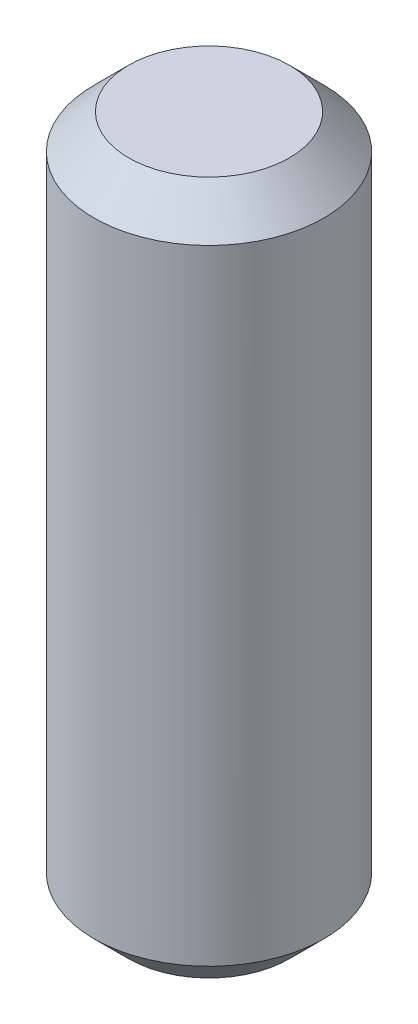
ISO-10303-21;
HEADER;
FILE_DESCRIPTION(('STEP AP214'),'2;1');
FILE_NAME('part.step','',(''),(''),'','','');
FILE_SCHEMA(('AUTOMOTIVE_DESIGN { 1 0 10303 214 1 1 1 1 }'));
ENDSEC;
DATA;
#1=APPLICATION_CONTEXT('core data for automotive mechanical design processes');
#2=APPLICATION_PROTOCOL_DEFINITION('international standard','automotive_design',2000,#1);
#3=PRODUCT_CONTEXT('',#1,'mechanical');
#4=PRODUCT('Part','Part','',(#3));
#5=PRODUCT_RELATED_PRODUCT_CATEGORY('part','',(#4));
#6=PRODUCT_DEFINITION_FORMATION('','',#4);
#7=PRODUCT_DEFINITION_CONTEXT('part definition',#1,'design');
#8=PRODUCT_DEFINITION('design','',#6,#7);
#9=PRODUCT_DEFINITION_SHAPE('','',#8);
#10=(LENGTH_UNIT() NAMED_UNIT(*) SI_UNIT(.MILLI.,.METRE.));
#11=(NAMED_UNIT(*) PLANE_ANGLE_UNIT() SI_UNIT($,.RADIAN.));
#12=(NAMED_UNIT(*) SI_UNIT($,.STERADIAN.) SOLID_ANGLE_UNIT());
#13=UNCERTAINTY_MEASURE_WITH_UNIT(LENGTH_MEASURE(1.E-05),#10,'distance_accuracy_value','');
#14=(GEOMETRIC_REPRESENTATION_CONTEXT(3) GLOBAL_UNCERTAINTY_ASSIGNED_CONTEXT((#13)) GLOBAL_UNIT_ASSIGNED_CONTEXT((#10,
#11,#12)) REPRESENTATION_CONTEXT('',''));
#15=CARTESIAN_POINT('',(0.,0.,0.));
#16=DIRECTION('',(0.,0.,1.));
#17=DIRECTION('',(1.,0.,0.));
#18=AXIS2_PLACEMENT_3D('',#15,#16,#17);
#19=CARTESIAN_POINT('',(0.,30.,0.));
#20=DIRECTION('',(0.,-1.,0.));
#21=DIRECTION('',(0.,0.,-1.));
#22=AXIS2_PLACEMENT_3D('',#19,#20,#21);
#23=CYLINDRICAL_SURFACE('',#22,4.975);
#24=CARTESIAN_POINT('',(0.,1.50000000000001,0.));
#25=DIRECTION('',(0.,1.,0.));
#26=DIRECTION('',(0.,0.,1.));
#27=AXIS2_PLACEMENT_3D('',#24,#25,#26);
#28=CIRCLE('',#27,4.975);
#29=CARTESIAN_POINT('',(0.,1.50000000000001,-4.975));
#30=VERTEX_POINT('',#29);
#31=EDGE_CURVE('E48',#30,#30,#28,.T.);
#32=CARTESIAN_POINT('',(0.,28.5,0.));
#33=DIRECTION('',(0.,1.,0.));
#34=DIRECTION('',(0.,0.,1.));
#35=AXIS2_PLACEMENT_3D('',#32,#33,#34);
#36=CIRCLE('',#35,4.975);
#37=CARTESIAN_POINT('',(0.,28.5,-4.975));
#38=VERTEX_POINT('',#37);
#39=EDGE_CURVE('E52',#38,#38,#36,.F.);
#40=CARTESIAN_POINT('',(0.,1.50000000000001,-4.975));
#41=CARTESIAN_POINT('',(0.,1.78125000000001,-4.975));
#42=CARTESIAN_POINT('',(0.,2.06250000000001,-4.975));
#43=CARTESIAN_POINT('',(0.,2.62500000000001,-4.975));
#44=CARTESIAN_POINT('',(0.,2.90625000000001,-4.975));
#45=CARTESIAN_POINT('',(0.,3.46875000000001,-4.975));
#46=CARTESIAN_POINT('',(0.,3.75000000000001,-4.975));
#47=CARTESIAN_POINT('',(0.,4.31250000000001,-4.975));
#48=CARTESIAN_POINT('',(0.,4.59375000000001,-4.975));
#49=CARTESIAN_POINT('',(0.,5.15625,-4.975));
#50=CARTESIAN_POINT('',(0.,5.4375,-4.975));
#51=CARTESIAN_POINT('',(0.,6.00000000000001,-4.975));
#52=CARTESIAN_POINT('',(0.,6.28125000000001,-4.975));
#53=CARTESIAN_POINT('',(0.,6.84375000000001,-4.975));
#54=CARTESIAN_POINT('',(0.,7.125,-4.975));
#55=CARTESIAN_POINT('',(0.,7.6875,-4.975));
#56=CARTESIAN_POINT('',(0.,7.96875,-4.975));
#57=CARTESIAN_POINT('',(0.,8.53125,-4.975));
#58=CARTESIAN_POINT('',(0.,8.8125,-4.975));
#59=CARTESIAN_POINT('',(0.,9.375,-4.975));
#60=CARTESIAN_POINT('',(0.,9.65625,-4.975));
#61=CARTESIAN_POINT('',(0.,10.21875,-4.975));
#62=CARTESIAN_POINT('',(0.,10.5,-4.975));
#63=CARTESIAN_POINT('',(0.,11.0625,-4.975));
#64=CARTESIAN_POINT('',(0.,11.34375,-4.975));
#65=CARTESIAN_POINT('',(0.,11.90625,-4.975));
#66=CARTESIAN_POINT('',(0.,12.1875,-4.975));
#67=CARTESIAN_POINT('',(0.,12.75,-4.975));
#68=CARTESIAN_POINT('',(0.,13.03125,-4.975));
#69=CARTESIAN_POINT('',(0.,13.59375,-4.975));
#70=CARTESIAN_POINT('',(0.,13.875,-4.975));
#71=CARTESIAN_POINT('',(0.,14.4375,-4.975));
#72=CARTESIAN_POINT('',(0.,14.71875,-4.975));
#73=CARTESIAN_POINT('',(0.,15.28125,-4.975));
#74=CARTESIAN_POINT('',(0.,15.5625,-4.975));
#75=CARTESIAN_POINT('',(0.,16.125,-4.975));
#76=CARTESIAN_POINT('',(0.,16.40625,-4.975));
#77=CARTESIAN_POINT('',(0.,16.96875,-4.975));
#78=CARTESIAN_POINT('',(0.,17.25,-4.975));
#79=CARTESIAN_POINT('',(0.,17.8125,-4.975));
#80=CARTESIAN_POINT('',(0.,18.09375,-4.975));
#81=CARTESIAN_POINT('',(0.,18.65625,-4.975));
#82=CARTESIAN_POINT('',(0.,18.9375,-4.975));
#83=CARTESIAN_POINT('',(0.,19.5,-4.975));
#84=CARTESIAN_POINT('',(0.,19.78125,-4.975));
#85=CARTESIAN_POINT('',(0.,20.34375,-4.975));
#86=CARTESIAN_POINT('',(0.,20.625,-4.975));
#87=CARTESIAN_POINT('',(0.,21.1875,-4.975));
#88=CARTESIAN_POINT('',(0.,21.46875,-4.975));
#89=CARTESIAN_POINT('',(0.,22.03125,-4.975));
#90=CARTESIAN_POINT('',(0.,22.3125,-4.975));
#91=CARTESIAN_POINT('',(0.,22.875,-4.975));
#92=CARTESIAN_POINT('',(0.,23.15625,-4.975));
#93=CARTESIAN_POINT('',(0.,23.71875,-4.975));
#94=CARTESIAN_POINT('',(0.,24.,-4.975));
#95=CARTESIAN_POINT('',(0.,24.5625,-4.975));
#96=CARTESIAN_POINT('',(0.,24.84375,-4.975));
#97=CARTESIAN_POINT('',(0.,25.40625,-4.975));
#98=CARTESIAN_POINT('',(0.,25.6875,-4.975));
#99=CARTESIAN_POINT('',(0.,26.25,-4.975));
#100=CARTESIAN_POINT('',(0.,26.53125,-4.975));
#101=CARTESIAN_POINT('',(0.,27.09375,-4.975));
#102=CARTESIAN_POINT('',(0.,27.375,-4.975));
#103=CARTESIAN_POINT('',(0.,27.9375,-4.975));
#104=CARTESIAN_POINT('',(0.,28.21875,-4.975));
#105=CARTESIAN_POINT('',(0.,28.5,-4.975));
#106=B_SPLINE_CURVE_WITH_KNOTS('',3,(#40,#41,#42,#43,#44,#45,#46,#47,#48,#49,#50,#51,#52,#53,
#54,#55,#56,#57,#58,#59,#60,#61,#62,#63,#64,#65,#66,#67,#68,#69,#70,#71,#72,#73,#74,#75,#76,#77,
#78,#79,#80,#81,#82,#83,#84,#85,#86,#87,#88,#89,#90,#91,#92,#93,#94,#95,#96,#97,#98,#99,#100,
#101,#102,#103,#104,#105),.UNSPECIFIED.,.F.,.F.,(4,2,2,2,2,2,2,2,2,2,2,2,2,2,2,2,2,2,2,2,2,2,2,
2,2,2,2,2,2,2,2,2,4),(0.,0.843750000000001,1.6875,2.53125,3.375,4.21875,5.0625,5.90624999999999,
6.74999999999999,7.59374999999999,8.43749999999999,9.28124999999999,10.125,10.96875,11.8125,
12.65625,13.5,14.34375,15.1875,16.03125,16.875,17.71875,18.5625,19.40625,20.25,21.09375,21.9375,
22.78125,23.625,24.46875,25.3125,26.15625,27.),.UNSPECIFIED.);
#107=EDGE_CURVE('BSEAM36',#30,#38,#106,.T.);
#108=ORIENTED_EDGE('',*,*,#31,.T.);
#109=ORIENTED_EDGE('',*,*,#39,.T.);
#110=ORIENTED_EDGE('',*,*,#107,.T.);
#111=ORIENTED_EDGE('',*,*,#107,.F.);
#112=EDGE_LOOP('',(#108,#110,#109,#111));
#113=FACE_BOUND('',#112,.T.);
#114=ADVANCED_FACE('F36',(#113),#23,.T.);
#115=CARTESIAN_POINT('',(0.,30.,0.));
#116=DIRECTION('',(0.,1.,0.));
#117=DIRECTION('',(0.,0.,1.));
#118=AXIS2_PLACEMENT_3D('',#115,#116,#117);
#119=PLANE('',#118);
#120=CARTESIAN_POINT('',(0.,30.,0.));
#121=DIRECTION('',(0.,1.,0.));
#122=DIRECTION('',(0.,0.,1.));
#123=AXIS2_PLACEMENT_3D('',#120,#121,#122);
#124=CIRCLE('',#123,3.47499999999999);
#125=CARTESIAN_POINT('',(0.,30.,-3.47499999999999));
#126=VERTEX_POINT('',#125);
#127=EDGE_CURVE('E10',#126,#126,#124,.T.);
#128=ORIENTED_EDGE('',*,*,#127,.T.);
#129=EDGE_LOOP('',(#128));
#130=FACE_BOUND('',#129,.T.);
#131=ADVANCED_FACE('F68',(#130),#119,.T.);
#132=CARTESIAN_POINT('',(0.,0.,0.));
#133=DIRECTION('',(0.,1.,0.));
#134=DIRECTION('',(0.,0.,1.));
#135=AXIS2_PLACEMENT_3D('',#132,#133,#134);
#136=PLANE('',#135);
#137=CARTESIAN_POINT('',(0.,0.,0.));
#138=DIRECTION('',(0.,1.,0.));
#139=DIRECTION('',(0.,0.,1.));
#140=AXIS2_PLACEMENT_3D('',#137,#138,#139);
#141=CIRCLE('',#140,3.47499999999999);
#142=CARTESIAN_POINT('',(0.,0.,3.47499999999999));
#143=VERTEX_POINT('',#142);
#144=EDGE_CURVE('E44',#143,#143,#141,.F.);
#145=ORIENTED_EDGE('',*,*,#144,.T.);
#146=EDGE_LOOP('',(#145));
#147=FACE_BOUND('',#146,.T.);
#148=ADVANCED_FACE('F65',(#147),#136,.F.);
#149=CARTESIAN_POINT('',(0.,1.50000000000001,0.));
#150=DIRECTION('',(0.,1.,0.));
#151=DIRECTION('',(0.,0.,1.));
#152=AXIS2_PLACEMENT_3D('',#149,#150,#151);
#153=CONICAL_SURFACE('',#152,4.975,0.785398163397449);
#154=ORIENTED_EDGE('',*,*,#144,.F.);
#155=EDGE_LOOP('',(#154));
#156=FACE_BOUND('',#155,.T.);
#157=ORIENTED_EDGE('',*,*,#31,.F.);
#158=EDGE_LOOP('',(#157));
#159=FACE_BOUND('',#158,.T.);
#160=ADVANCED_FACE('F61',(#156,#159),#153,.T.);
#161=CARTESIAN_POINT('',(0.,30.,0.));
#162=DIRECTION('',(0.,-1.,0.));
#163=DIRECTION('',(0.,0.,-1.));
#164=AXIS2_PLACEMENT_3D('',#161,#162,#163);
#165=CONICAL_SURFACE('',#164,3.47499999999999,0.785398163397448);
#166=CARTESIAN_POINT('',(0.,28.5,-4.975));
#167=CARTESIAN_POINT('',(0.,28.515625,-4.959375));
#168=CARTESIAN_POINT('',(0.,28.53125,-4.94375));
#169=CARTESIAN_POINT('',(0.,28.5625,-4.9125));
#170=CARTESIAN_POINT('',(0.,28.578125,-4.896875));
#171=CARTESIAN_POINT('',(0.,28.609375,-4.865625));
#172=CARTESIAN_POINT('',(0.,28.625,-4.85));
#173=CARTESIAN_POINT('',(0.,28.65625,-4.81875));
#174=CARTESIAN_POINT('',(0.,28.671875,-4.803125));
#175=CARTESIAN_POINT('',(0.,28.703125,-4.771875));
#176=CARTESIAN_POINT('',(0.,28.71875,-4.75625));
#177=CARTESIAN_POINT('',(0.,28.75,-4.725));
#178=CARTESIAN_POINT('',(0.,28.765625,-4.709375));
#179=CARTESIAN_POINT('',(0.,28.796875,-4.678125));
#180=CARTESIAN_POINT('',(0.,28.8125,-4.6625));
#181=CARTESIAN_POINT('',(0.,28.84375,-4.63125));
#182=CARTESIAN_POINT('',(0.,28.859375,-4.615625));
#183=CARTESIAN_POINT('',(0.,28.890625,-4.584375));
#184=CARTESIAN_POINT('',(0.,28.90625,-4.56875));
#185=CARTESIAN_POINT('',(0.,28.9375,-4.5375));
#186=CARTESIAN_POINT('',(0.,28.953125,-4.521875));
#187=CARTESIAN_POINT('',(0.,28.984375,-4.490625));
#188=CARTESIAN_POINT('',(0.,29.,-4.475));
#189=CARTESIAN_POINT('',(0.,29.03125,-4.44375));
#190=CARTESIAN_POINT('',(0.,29.046875,-4.428125));
#191=CARTESIAN_POINT('',(0.,29.078125,-4.396875));
#192=CARTESIAN_POINT('',(0.,29.09375,-4.38125));
#193=CARTESIAN_POINT('',(0.,29.125,-4.35));
#194=CARTESIAN_POINT('',(0.,29.140625,-4.334375));
#195=CARTESIAN_POINT('',(0.,29.171875,-4.303125));
#196=CARTESIAN_POINT('',(0.,29.1875,-4.2875));
#197=CARTESIAN_POINT('',(0.,29.21875,-4.25625));
#198=CARTESIAN_POINT('',(0.,29.234375,-4.240625));
#199=CARTESIAN_POINT('',(0.,29.265625,-4.209375));
#200=CARTESIAN_POINT('',(0.,29.28125,-4.19375));
#201=CARTESIAN_POINT('',(0.,29.3125,-4.1625));
#202=CARTESIAN_POINT('',(0.,29.328125,-4.146875));
#203=CARTESIAN_POINT('',(0.,29.359375,-4.115625));
#204=CARTESIAN_POINT('',(0.,29.375,-4.1));
#205=CARTESIAN_POINT('',(0.,29.40625,-4.06875));
#206=CARTESIAN_POINT('',(0.,29.421875,-4.05312499999999));
#207=CARTESIAN_POINT('',(0.,29.453125,-4.02187499999999));
#208=CARTESIAN_POINT('',(0.,29.46875,-4.00624999999999));
#209=CARTESIAN_POINT('',(0.,29.5,-3.97499999999999));
#210=CARTESIAN_POINT('',(0.,29.515625,-3.959375));
#211=CARTESIAN_POINT('',(0.,29.546875,-3.92812499999999));
#212=CARTESIAN_POINT('',(0.,29.5625,-3.91249999999999));
#213=CARTESIAN_POINT('',(0.,29.59375,-3.88124999999999));
#214=CARTESIAN_POINT('',(0.,29.609375,-3.86562499999999));
#215=CARTESIAN_POINT('',(0.,29.640625,-3.83437499999999));
#216=CARTESIAN_POINT('',(0.,29.65625,-3.81874999999999));
#217=CARTESIAN_POINT('',(0.,29.6875,-3.78749999999999));
#218=CARTESIAN_POINT('',(0.,29.703125,-3.77187499999999));
#219=CARTESIAN_POINT('',(0.,29.734375,-3.74062499999999));
#220=CARTESIAN_POINT('',(0.,29.75,-3.72499999999999));
#221=CARTESIAN_POINT('',(0.,29.78125,-3.69374999999999));
#222=CARTESIAN_POINT('',(0.,29.796875,-3.67812499999999));
#223=CARTESIAN_POINT('',(0.,29.828125,-3.64687499999999));
#224=CARTESIAN_POINT('',(0.,29.84375,-3.63124999999999));
#225=CARTESIAN_POINT('',(0.,29.875,-3.59999999999999));
#226=CARTESIAN_POINT('',(0.,29.890625,-3.58437499999999));
#227=CARTESIAN_POINT('',(0.,29.921875,-3.55312499999999));
#228=CARTESIAN_POINT('',(0.,29.9375,-3.53749999999999));
#229=CARTESIAN_POINT('',(0.,29.96875,-3.50624999999999));
#230=CARTESIAN_POINT('',(0.,29.984375,-3.49062499999999));
#231=CARTESIAN_POINT('',(0.,30.,-3.47499999999999));
#232=B_SPLINE_CURVE_WITH_KNOTS('',3,(#166,#167,#168,#169,#170,#171,#172,#173,#174,#175,#176,
#177,#178,#179,#180,#181,#182,#183,#184,#185,#186,#187,#188,#189,#190,#191,#192,#193,#194,#195,
#196,#197,#198,#199,#200,#201,#202,#203,#204,#205,#206,#207,#208,#209,#210,#211,#212,#213,#214,
#215,#216,#217,#218,#219,#220,#221,#222,#223,#224,#225,#226,#227,#228,#229,#230,#231),
.UNSPECIFIED.,.F.,.F.,(4,2,2,2,2,2,2,2,2,2,2,2,2,2,2,2,2,2,2,2,2,2,2,2,2,2,2,2,2,2,2,2,4),(0.,
0.0662912607362377,0.132582521472478,0.198873782208716,0.265165042944957,0.331456303681197,
0.397747564417435,0.464038825153675,0.530330085889913,0.596621346626154,0.662912607362391,
0.729203868098631,0.795495128834872,0.86178638957111,0.92807765030735,0.994368911043588,
1.06066017177983,1.12695143251607,1.19324269325231,1.25953395398855,1.32582521472478,
1.39211647546103,1.45840773619727,1.5246989969335,1.59099025766974,1.65728151840598,
1.72357277914222,1.78986403987846,1.8561553006147,1.92244656135094,1.98873782208718,
2.05502908282342,2.12132034355966),.UNSPECIFIED.);
#233=EDGE_CURVE('BSEAM39',#38,#126,#232,.T.);
#234=ORIENTED_EDGE('',*,*,#39,.F.);
#235=ORIENTED_EDGE('',*,*,#127,.F.);
#236=ORIENTED_EDGE('',*,*,#233,.T.);
#237=ORIENTED_EDGE('',*,*,#233,.F.);
#238=EDGE_LOOP('',(#234,#236,#235,#237));
#239=FACE_BOUND('',#238,.T.);
#240=ADVANCED_FACE('F39',(#239),#165,.T.);
#241=CLOSED_SHELL('',(#114,#131,#148,#160,#240));
#242=MANIFOLD_SOLID_BREP('B2',#241);
#243=ADVANCED_BREP_SHAPE_REPRESENTATION('',(#18,#242),#14);
#244=SHAPE_DEFINITION_REPRESENTATION(#9,#243);
ENDSEC;
END-ISO-10303-21;
